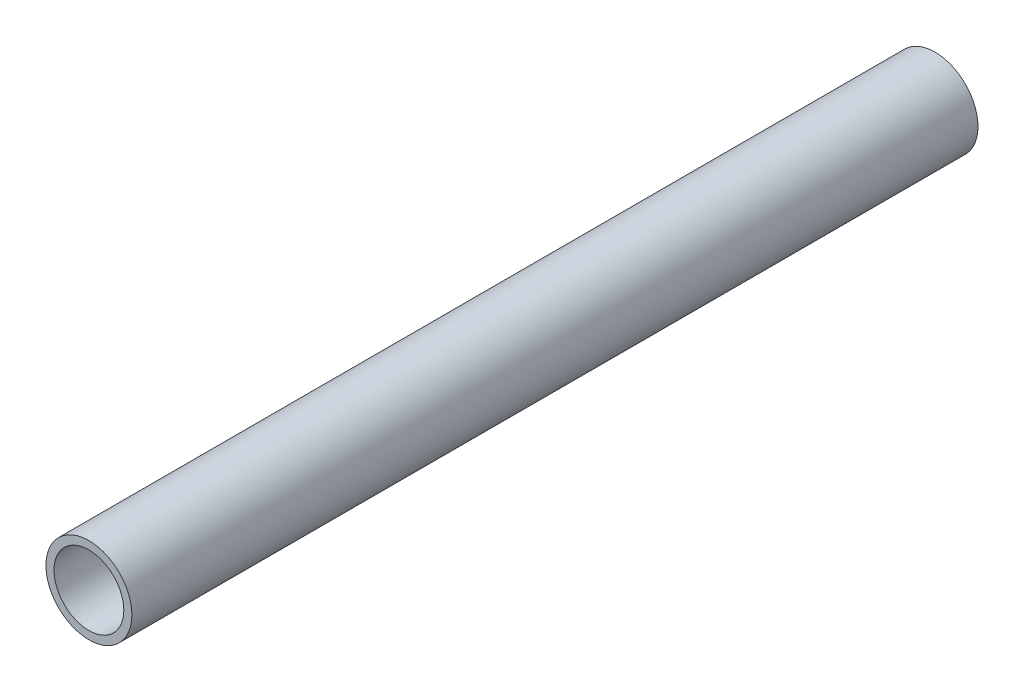
ISO-10303-21;
HEADER;
FILE_DESCRIPTION(('STEP AP214'),'2;1');
FILE_NAME('part.step','',(''),(''),'','','');
FILE_SCHEMA(('AUTOMOTIVE_DESIGN { 1 0 10303 214 1 1 1 1 }'));
ENDSEC;
DATA;
#1=APPLICATION_CONTEXT('core data for automotive mechanical design processes');
#2=APPLICATION_PROTOCOL_DEFINITION('international standard','automotive_design',2000,#1);
#3=PRODUCT_CONTEXT('',#1,'mechanical');
#4=PRODUCT('Part','Part','',(#3));
#5=PRODUCT_RELATED_PRODUCT_CATEGORY('part','',(#4));
#6=PRODUCT_DEFINITION_FORMATION('','',#4);
#7=PRODUCT_DEFINITION_CONTEXT('part definition',#1,'design');
#8=PRODUCT_DEFINITION('design','',#6,#7);
#9=PRODUCT_DEFINITION_SHAPE('','',#8);
#10=(LENGTH_UNIT() NAMED_UNIT(*) SI_UNIT(.MILLI.,.METRE.));
#11=(NAMED_UNIT(*) PLANE_ANGLE_UNIT() SI_UNIT($,.RADIAN.));
#12=(NAMED_UNIT(*) SI_UNIT($,.STERADIAN.) SOLID_ANGLE_UNIT());
#13=UNCERTAINTY_MEASURE_WITH_UNIT(LENGTH_MEASURE(1.E-05),#10,'distance_accuracy_value','');
#14=(GEOMETRIC_REPRESENTATION_CONTEXT(3) GLOBAL_UNCERTAINTY_ASSIGNED_CONTEXT((#13)) GLOBAL_UNIT_ASSIGNED_CONTEXT((#10,
#11,#12)) REPRESENTATION_CONTEXT('',''));
#15=CARTESIAN_POINT('',(0.,0.,0.));
#16=DIRECTION('',(0.,0.,1.));
#17=DIRECTION('',(1.,0.,0.));
#18=AXIS2_PLACEMENT_3D('',#15,#16,#17);
#19=CARTESIAN_POINT('',(0.,0.,157.5));
#20=DIRECTION('',(0.,0.,-1.));
#21=DIRECTION('',(-1.,0.,0.));
#22=AXIS2_PLACEMENT_3D('',#19,#20,#21);
#23=CYLINDRICAL_SURFACE('',#22,16.);
#24=CARTESIAN_POINT('',(0.,0.,157.5));
#25=DIRECTION('',(0.,0.,1.));
#26=DIRECTION('',(1.,0.,0.));
#27=AXIS2_PLACEMENT_3D('',#24,#25,#26);
#28=CIRCLE('',#27,16.);
#29=CARTESIAN_POINT('',(16.,0.,157.5));
#30=VERTEX_POINT('',#29);
#31=EDGE_CURVE('E10',#30,#30,#28,.T.);
#32=ORIENTED_EDGE('',*,*,#31,.F.);
#33=EDGE_LOOP('',(#32));
#34=FACE_BOUND('',#33,.T.);
#35=CARTESIAN_POINT('',(0.,0.,-157.5));
#36=DIRECTION('',(0.,0.,1.));
#37=DIRECTION('',(1.,0.,0.));
#38=AXIS2_PLACEMENT_3D('',#35,#36,#37);
#39=CIRCLE('',#38,16.);
#40=CARTESIAN_POINT('',(16.,0.,-157.5));
#41=VERTEX_POINT('',#40);
#42=EDGE_CURVE('E36',#41,#41,#39,.T.);
#43=ORIENTED_EDGE('',*,*,#42,.T.);
#44=EDGE_LOOP('',(#43));
#45=FACE_BOUND('',#44,.T.);
#46=ADVANCED_FACE('F33',(#34,#45),#23,.T.);
#47=CARTESIAN_POINT('',(0.,0.,157.5));
#48=DIRECTION('',(0.,0.,1.));
#49=DIRECTION('',(1.,0.,0.));
#50=AXIS2_PLACEMENT_3D('',#47,#48,#49);
#51=PLANE('',#50);
#52=CARTESIAN_POINT('',(0.,0.,157.5));
#53=DIRECTION('',(0.,0.,1.));
#54=DIRECTION('',(1.,0.,0.));
#55=AXIS2_PLACEMENT_3D('',#52,#53,#54);
#56=CIRCLE('',#55,13.);
#57=CARTESIAN_POINT('',(13.,0.,157.5));
#58=VERTEX_POINT('',#57);
#59=EDGE_CURVE('E43',#58,#58,#56,.T.);
#60=ORIENTED_EDGE('',*,*,#59,.F.);
#61=EDGE_LOOP('',(#60));
#62=FACE_BOUND('',#61,.T.);
#63=ORIENTED_EDGE('',*,*,#31,.T.);
#64=EDGE_LOOP('',(#63));
#65=FACE_BOUND('',#64,.T.);
#66=ADVANCED_FACE('F54',(#62,#65),#51,.T.);
#67=CARTESIAN_POINT('',(0.,0.,-157.5));
#68=DIRECTION('',(0.,0.,1.));
#69=DIRECTION('',(1.,0.,0.));
#70=AXIS2_PLACEMENT_3D('',#67,#68,#69);
#71=PLANE('',#70);
#72=CARTESIAN_POINT('',(0.,0.,-157.5));
#73=DIRECTION('',(0.,0.,1.));
#74=DIRECTION('',(1.,0.,0.));
#75=AXIS2_PLACEMENT_3D('',#72,#73,#74);
#76=CIRCLE('',#75,13.);
#77=CARTESIAN_POINT('',(13.,0.,-157.5));
#78=VERTEX_POINT('',#77);
#79=EDGE_CURVE('E45',#78,#78,#76,.T.);
#80=ORIENTED_EDGE('',*,*,#79,.T.);
#81=EDGE_LOOP('',(#80));
#82=FACE_BOUND('',#81,.T.);
#83=ORIENTED_EDGE('',*,*,#42,.F.);
#84=EDGE_LOOP('',(#83));
#85=FACE_BOUND('',#84,.T.);
#86=ADVANCED_FACE('F56',(#82,#85),#71,.F.);
#87=CARTESIAN_POINT('',(0.,0.,157.5));
#88=DIRECTION('',(0.,0.,-1.));
#89=DIRECTION('',(-1.,0.,0.));
#90=AXIS2_PLACEMENT_3D('',#87,#88,#89);
#91=CYLINDRICAL_SURFACE('',#90,13.);
#92=ORIENTED_EDGE('',*,*,#59,.T.);
#93=EDGE_LOOP('',(#92));
#94=FACE_BOUND('',#93,.T.);
#95=ORIENTED_EDGE('',*,*,#79,.F.);
#96=EDGE_LOOP('',(#95));
#97=FACE_BOUND('',#96,.T.);
#98=ADVANCED_FACE('F51',(#94,#97),#91,.F.);
#99=CLOSED_SHELL('',(#46,#66,#86,#98));
#100=MANIFOLD_SOLID_BREP('B2',#99);
#101=ADVANCED_BREP_SHAPE_REPRESENTATION('',(#18,#100),#14);
#102=SHAPE_DEFINITION_REPRESENTATION(#9,#101);
ENDSEC;
END-ISO-10303-21;
